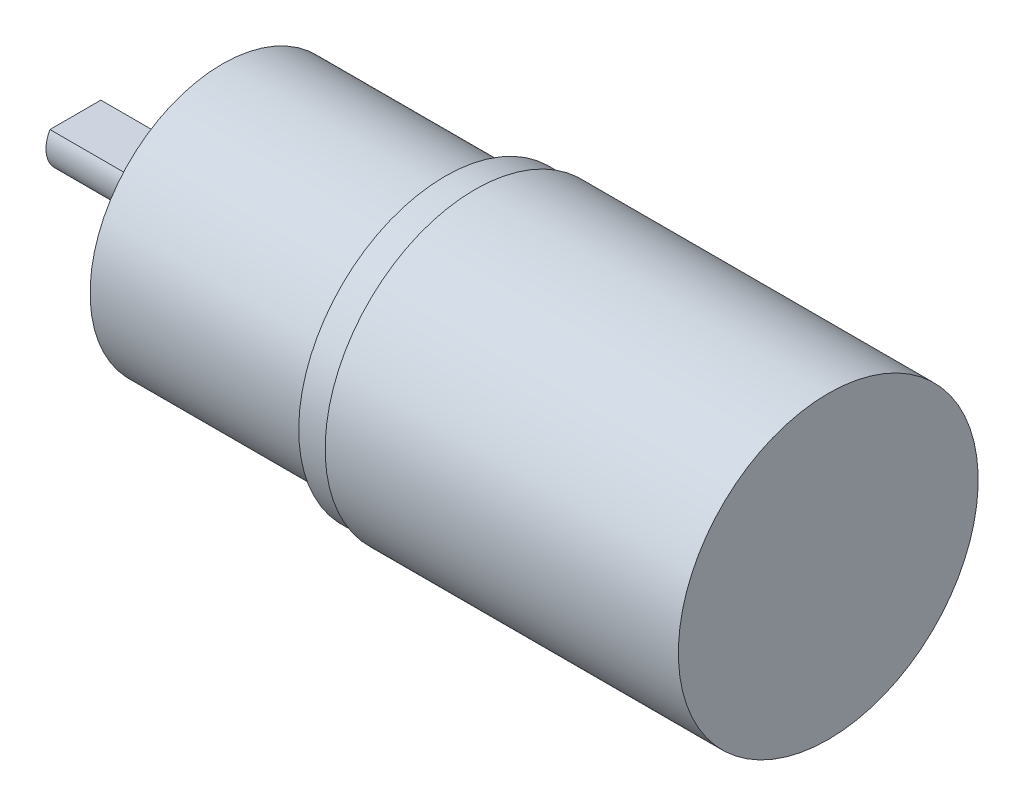
ISO-10303-21;
HEADER;
FILE_DESCRIPTION(('STEP AP214'),'2;1');
FILE_NAME('part.step','',(''),(''),'','','');
FILE_SCHEMA(('AUTOMOTIVE_DESIGN { 1 0 10303 214 1 1 1 1 }'));
ENDSEC;
DATA;
#1=APPLICATION_CONTEXT('core data for automotive mechanical design processes');
#2=APPLICATION_PROTOCOL_DEFINITION('international standard','automotive_design',2000,#1);
#3=PRODUCT_CONTEXT('',#1,'mechanical');
#4=PRODUCT('Part','Part','',(#3));
#5=PRODUCT_RELATED_PRODUCT_CATEGORY('part','',(#4));
#6=PRODUCT_DEFINITION_FORMATION('','',#4);
#7=PRODUCT_DEFINITION_CONTEXT('part definition',#1,'design');
#8=PRODUCT_DEFINITION('design','',#6,#7);
#9=PRODUCT_DEFINITION_SHAPE('','',#8);
#10=(LENGTH_UNIT() NAMED_UNIT(*) SI_UNIT(.MILLI.,.METRE.));
#11=(NAMED_UNIT(*) PLANE_ANGLE_UNIT() SI_UNIT($,.RADIAN.));
#12=(NAMED_UNIT(*) SI_UNIT($,.STERADIAN.) SOLID_ANGLE_UNIT());
#13=UNCERTAINTY_MEASURE_WITH_UNIT(LENGTH_MEASURE(1.E-05),#10,'distance_accuracy_value','');
#14=(GEOMETRIC_REPRESENTATION_CONTEXT(3) GLOBAL_UNCERTAINTY_ASSIGNED_CONTEXT((#13)) GLOBAL_UNIT_ASSIGNED_CONTEXT((#10,
#11,#12)) REPRESENTATION_CONTEXT('',''));
#15=CARTESIAN_POINT('',(0.,0.,0.));
#16=DIRECTION('',(0.,0.,1.));
#17=DIRECTION('',(1.,0.,0.));
#18=AXIS2_PLACEMENT_3D('',#15,#16,#17);
#19=CARTESIAN_POINT('',(15.2822204493793,23.8309239852396,0.));
#20=DIRECTION('',(1.,0.,0.));
#21=DIRECTION('',(0.,1.,0.));
#22=AXIS2_PLACEMENT_3D('',#19,#20,#21);
#23=PLANE('',#22);
#24=CARTESIAN_POINT('',(15.2822204493793,3.43482527761444,0.));
#25=DIRECTION('',(1.,0.,0.));
#26=DIRECTION('',(0.,1.,0.));
#27=AXIS2_PLACEMENT_3D('',#24,#25,#26);
#28=CIRCLE('',#27,20.3960987076252);
#29=CARTESIAN_POINT('',(15.2822204493793,23.8309239852396,0.));
#30=VERTEX_POINT('',#29);
#31=EDGE_CURVE('E105',#30,#30,#28,.T.);
#32=ORIENTED_EDGE('',*,*,#31,.T.);
#33=EDGE_LOOP('',(#32));
#34=FACE_BOUND('',#33,.T.);
#35=ADVANCED_FACE('F33',(#34),#23,.T.);
#36=CARTESIAN_POINT('',(-87.1529344386655,7.43482527761442,0.));
#37=DIRECTION('',(-1.,0.,0.));
#38=DIRECTION('',(0.,-1.,0.));
#39=AXIS2_PLACEMENT_3D('',#36,#37,#38);
#40=PLANE('',#39);
#41=DIRECTION('',(0.,0.,1.));
#42=VECTOR('',#41,1.);
#43=CARTESIAN_POINT('',(-87.1529344386655,5.43482527761442,-6.91077848861216));
#44=LINE('',#43,#42);
#45=CARTESIAN_POINT('',(-87.1529344386655,5.43482527761442,-3.46410161513775));
#46=VERTEX_POINT('',#45);
#47=CARTESIAN_POINT('',(-87.1529344386655,5.43482527761442,3.46410161513775));
#48=VERTEX_POINT('',#47);
#49=EDGE_CURVE('E70',#46,#48,#44,.T.);
#50=ORIENTED_EDGE('',*,*,#49,.F.);
#51=CARTESIAN_POINT('',(-87.1529344386655,3.43482527761442,0.));
#52=DIRECTION('',(1.,0.,0.));
#53=DIRECTION('',(0.,1.,0.));
#54=AXIS2_PLACEMENT_3D('',#51,#52,#53);
#55=CIRCLE('',#54,4.);
#56=EDGE_CURVE('E78',#48,#46,#55,.T.);
#57=ORIENTED_EDGE('',*,*,#56,.F.);
#58=EDGE_LOOP('',(#50,#57));
#59=FACE_BOUND('',#58,.T.);
#60=ADVANCED_FACE('F77',(#59),#40,.T.);
#61=CARTESIAN_POINT('',(15.2822204493793,3.43482527761444,0.));
#62=DIRECTION('',(1.,0.,0.));
#63=DIRECTION('',(0.,1.,0.));
#64=AXIS2_PLACEMENT_3D('',#61,#62,#63);
#65=CYLINDRICAL_SURFACE('',#64,4.);
#66=DIRECTION('',(1.,0.,0.));
#67=VECTOR('',#66,1.);
#68=CARTESIAN_POINT('',(15.2822204493793,5.43482527761444,-3.46410161513775));
#69=LINE('',#68,#67);
#70=CARTESIAN_POINT('',(-72.1529344386655,5.43482527761442,-3.46410161513775));
#71=VERTEX_POINT('',#70);
#72=EDGE_CURVE('E11',#71,#46,#69,.F.);
#73=ORIENTED_EDGE('',*,*,#72,.F.);
#74=CARTESIAN_POINT('',(-72.1529344386655,3.43482527761443,0.));
#75=DIRECTION('',(1.,0.,0.));
#76=DIRECTION('',(0.,0.,-1.));
#77=AXIS2_PLACEMENT_3D('',#74,#75,#76);
#78=CIRCLE('',#77,4.);
#79=CARTESIAN_POINT('',(-72.1529344386655,5.43482527761442,3.46410161513775));
#80=VERTEX_POINT('',#79);
#81=EDGE_CURVE('E82',#80,#71,#78,.F.);
#82=ORIENTED_EDGE('',*,*,#81,.F.);
#83=DIRECTION('',(1.,0.,0.));
#84=VECTOR('',#83,1.);
#85=CARTESIAN_POINT('',(15.2822204493793,5.43482527761444,3.46410161513775));
#86=LINE('',#85,#84);
#87=EDGE_CURVE('E40',#48,#80,#86,.T.);
#88=ORIENTED_EDGE('',*,*,#87,.F.);
#89=ORIENTED_EDGE('',*,*,#56,.T.);
#90=EDGE_LOOP('',(#73,#82,#88,#89));
#91=FACE_BOUND('',#90,.T.);
#92=CARTESIAN_POINT('',(-69.6840575003762,3.43482527761443,0.));
#93=DIRECTION('',(1.,0.,0.));
#94=DIRECTION('',(0.,1.,0.));
#95=AXIS2_PLACEMENT_3D('',#92,#93,#94);
#96=CIRCLE('',#95,4.);
#97=CARTESIAN_POINT('',(-69.6840575003762,7.43482527761442,0.));
#98=VERTEX_POINT('',#97);
#99=EDGE_CURVE('E83',#98,#98,#96,.T.);
#100=ORIENTED_EDGE('',*,*,#99,.F.);
#101=EDGE_LOOP('',(#100));
#102=FACE_BOUND('',#101,.T.);
#103=ADVANCED_FACE('F80',(#91,#102),#65,.T.);
#104=CARTESIAN_POINT('',(-69.6840575003762,9.2736544290133,0.));
#105=DIRECTION('',(-1.,0.,0.));
#106=DIRECTION('',(0.,-1.,0.));
#107=AXIS2_PLACEMENT_3D('',#104,#105,#106);
#108=PLANE('',#107);
#109=ORIENTED_EDGE('',*,*,#99,.T.);
#110=EDGE_LOOP('',(#109));
#111=FACE_BOUND('',#110,.T.);
#112=CARTESIAN_POINT('',(-69.6840575003762,3.43482527761443,0.));
#113=DIRECTION('',(1.,0.,0.));
#114=DIRECTION('',(0.,1.,0.));
#115=AXIS2_PLACEMENT_3D('',#112,#113,#114);
#116=CIRCLE('',#115,5.83882915139887);
#117=CARTESIAN_POINT('',(-69.6840575003762,9.2736544290133,0.));
#118=VERTEX_POINT('',#117);
#119=EDGE_CURVE('E87',#118,#118,#116,.T.);
#120=ORIENTED_EDGE('',*,*,#119,.F.);
#121=EDGE_LOOP('',(#120));
#122=FACE_BOUND('',#121,.T.);
#123=ADVANCED_FACE('F143',(#111,#122),#108,.T.);
#124=CARTESIAN_POINT('',(15.2822204493793,3.43482527761444,0.));
#125=DIRECTION('',(1.,0.,0.));
#126=DIRECTION('',(0.,1.,0.));
#127=AXIS2_PLACEMENT_3D('',#124,#125,#126);
#128=CYLINDRICAL_SURFACE('',#127,5.83882915139887);
#129=ORIENTED_EDGE('',*,*,#119,.T.);
#130=EDGE_LOOP('',(#129));
#131=FACE_BOUND('',#130,.T.);
#132=CARTESIAN_POINT('',(-68.9178786872933,3.43482527761443,0.));
#133=DIRECTION('',(1.,0.,0.));
#134=DIRECTION('',(0.,1.,0.));
#135=AXIS2_PLACEMENT_3D('',#132,#133,#134);
#136=CIRCLE('',#135,5.83882915139887);
#137=CARTESIAN_POINT('',(-68.9178786872933,9.2736544290133,0.));
#138=VERTEX_POINT('',#137);
#139=EDGE_CURVE('E135',#138,#138,#136,.T.);
#140=ORIENTED_EDGE('',*,*,#139,.F.);
#141=EDGE_LOOP('',(#140));
#142=FACE_BOUND('',#141,.T.);
#143=ADVANCED_FACE('F140',(#131,#142),#128,.T.);
#144=CARTESIAN_POINT('',(-68.9178786872933,14.4348252776144,0.));
#145=DIRECTION('',(-1.,0.,0.));
#146=DIRECTION('',(0.,-1.,0.));
#147=AXIS2_PLACEMENT_3D('',#144,#145,#146);
#148=PLANE('',#147);
#149=ORIENTED_EDGE('',*,*,#139,.T.);
#150=EDGE_LOOP('',(#149));
#151=FACE_BOUND('',#150,.T.);
#152=CARTESIAN_POINT('',(-68.9178786872933,3.43482527761443,0.));
#153=DIRECTION('',(1.,0.,0.));
#154=DIRECTION('',(0.,1.,0.));
#155=AXIS2_PLACEMENT_3D('',#152,#153,#154);
#156=CIRCLE('',#155,11.);
#157=CARTESIAN_POINT('',(-68.9178786872933,14.4348252776144,0.));
#158=VERTEX_POINT('',#157);
#159=EDGE_CURVE('E132',#158,#158,#156,.T.);
#160=ORIENTED_EDGE('',*,*,#159,.F.);
#161=EDGE_LOOP('',(#160));
#162=FACE_BOUND('',#161,.T.);
#163=ADVANCED_FACE('F151',(#151,#162),#148,.T.);
#164=CARTESIAN_POINT('',(15.2822204493793,3.43482527761444,0.));
#165=DIRECTION('',(1.,0.,0.));
#166=DIRECTION('',(0.,1.,0.));
#167=AXIS2_PLACEMENT_3D('',#164,#165,#166);
#168=CYLINDRICAL_SURFACE('',#167,11.);
#169=ORIENTED_EDGE('',*,*,#159,.T.);
#170=EDGE_LOOP('',(#169));
#171=FACE_BOUND('',#170,.T.);
#172=CARTESIAN_POINT('',(-67.1529344386655,3.43482527761443,0.));
#173=DIRECTION('',(1.,0.,0.));
#174=DIRECTION('',(0.,1.,0.));
#175=AXIS2_PLACEMENT_3D('',#172,#173,#174);
#176=CIRCLE('',#175,11.);
#177=CARTESIAN_POINT('',(-67.1529344386655,14.4348252776144,0.));
#178=VERTEX_POINT('',#177);
#179=EDGE_CURVE('E129',#178,#178,#176,.T.);
#180=ORIENTED_EDGE('',*,*,#179,.F.);
#181=EDGE_LOOP('',(#180));
#182=FACE_BOUND('',#181,.T.);
#183=ADVANCED_FACE('F157',(#171,#182),#168,.T.);
#184=CARTESIAN_POINT('',(-67.1529344386655,21.4348252776144,0.));
#185=DIRECTION('',(-1.,0.,0.));
#186=DIRECTION('',(0.,-1.,0.));
#187=AXIS2_PLACEMENT_3D('',#184,#185,#186);
#188=PLANE('',#187);
#189=CARTESIAN_POINT('',(-67.1529344386655,13.3503239652306,-9.91549868761621));
#190=DIRECTION('',(-1.,0.,0.));
#191=DIRECTION('',(0.,0.,1.));
#192=AXIS2_PLACEMENT_3D('',#189,#190,#191);
#193=CIRCLE('',#192,1.49999999999999);
#194=CARTESIAN_POINT('',(-67.1529344386655,13.3503239652306,-8.41549868761622));
#195=VERTEX_POINT('',#194);
#196=EDGE_CURVE('E223',#195,#195,#193,.T.);
#197=ORIENTED_EDGE('',*,*,#196,.F.);
#198=EDGE_LOOP('',(#197));
#199=FACE_BOUND('',#198,.T.);
#200=CARTESIAN_POINT('',(-67.1529344386655,13.3503239652306,9.91549868761617));
#201=DIRECTION('',(-1.,0.,0.));
#202=DIRECTION('',(0.,0.,1.));
#203=AXIS2_PLACEMENT_3D('',#200,#201,#202);
#204=CIRCLE('',#203,1.49999999999999);
#205=CARTESIAN_POINT('',(-67.1529344386655,13.3503239652306,11.4154986876162));
#206=VERTEX_POINT('',#205);
#207=EDGE_CURVE('E225',#206,#206,#204,.T.);
#208=ORIENTED_EDGE('',*,*,#207,.F.);
#209=EDGE_LOOP('',(#208));
#210=FACE_BOUND('',#209,.T.);
#211=CARTESIAN_POINT('',(-67.1529344386655,-6.48067341000174,9.91549868761621));
#212=DIRECTION('',(-1.,0.,0.));
#213=DIRECTION('',(0.,0.,1.));
#214=AXIS2_PLACEMENT_3D('',#211,#212,#213);
#215=CIRCLE('',#214,1.49999999999999);
#216=CARTESIAN_POINT('',(-67.1529344386655,-6.48067341000174,11.4154986876162));
#217=VERTEX_POINT('',#216);
#218=EDGE_CURVE('E234',#217,#217,#215,.T.);
#219=ORIENTED_EDGE('',*,*,#218,.F.);
#220=EDGE_LOOP('',(#219));
#221=FACE_BOUND('',#220,.T.);
#222=CARTESIAN_POINT('',(-67.1529344386655,-6.48067341000178,-9.91549868761617));
#223=DIRECTION('',(-1.,0.,0.));
#224=DIRECTION('',(0.,0.,1.));
#225=AXIS2_PLACEMENT_3D('',#222,#223,#224);
#226=CIRCLE('',#225,1.49999999999999);
#227=CARTESIAN_POINT('',(-67.1529344386655,-6.48067341000178,-8.41549868761618));
#228=VERTEX_POINT('',#227);
#229=EDGE_CURVE('E114',#228,#228,#226,.T.);
#230=ORIENTED_EDGE('',*,*,#229,.F.);
#231=EDGE_LOOP('',(#230));
#232=FACE_BOUND('',#231,.T.);
#233=ORIENTED_EDGE('',*,*,#179,.T.);
#234=EDGE_LOOP('',(#233));
#235=FACE_BOUND('',#234,.T.);
#236=CARTESIAN_POINT('',(-67.1529344386655,3.43482527761443,0.));
#237=DIRECTION('',(1.,0.,0.));
#238=DIRECTION('',(0.,1.,0.));
#239=AXIS2_PLACEMENT_3D('',#236,#237,#238);
#240=CIRCLE('',#239,18.);
#241=CARTESIAN_POINT('',(-67.1529344386655,21.4348252776144,0.));
#242=VERTEX_POINT('',#241);
#243=EDGE_CURVE('E126',#242,#242,#240,.T.);
#244=ORIENTED_EDGE('',*,*,#243,.F.);
#245=EDGE_LOOP('',(#244));
#246=FACE_BOUND('',#245,.T.);
#247=ADVANCED_FACE('F161',(#199,#210,#221,#232,#235,#246),#188,.T.);
#248=CARTESIAN_POINT('',(15.2822204493793,3.43482527761444,0.));
#249=DIRECTION('',(1.,0.,0.));
#250=DIRECTION('',(0.,1.,0.));
#251=AXIS2_PLACEMENT_3D('',#248,#249,#250);
#252=CYLINDRICAL_SURFACE('',#251,18.);
#253=ORIENTED_EDGE('',*,*,#243,.T.);
#254=EDGE_LOOP('',(#253));
#255=FACE_BOUND('',#254,.T.);
#256=CARTESIAN_POINT('',(-36.8532953597755,3.43482527761443,0.));
#257=DIRECTION('',(1.,0.,0.));
#258=DIRECTION('',(0.,1.,0.));
#259=AXIS2_PLACEMENT_3D('',#256,#257,#258);
#260=CIRCLE('',#259,18.);
#261=CARTESIAN_POINT('',(-36.8532953597755,21.4348252776144,0.));
#262=VERTEX_POINT('',#261);
#263=EDGE_CURVE('E123',#262,#262,#260,.T.);
#264=ORIENTED_EDGE('',*,*,#263,.F.);
#265=EDGE_LOOP('',(#264));
#266=FACE_BOUND('',#265,.T.);
#267=ADVANCED_FACE('F165',(#255,#266),#252,.T.);
#268=CARTESIAN_POINT('',(-36.8532953597755,23.3502723103216,0.));
#269=DIRECTION('',(-1.,0.,0.));
#270=DIRECTION('',(0.,-1.,0.));
#271=AXIS2_PLACEMENT_3D('',#268,#269,#270);
#272=PLANE('',#271);
#273=ORIENTED_EDGE('',*,*,#263,.T.);
#274=EDGE_LOOP('',(#273));
#275=FACE_BOUND('',#274,.T.);
#276=CARTESIAN_POINT('',(-36.8532953597755,3.43482527761443,0.));
#277=DIRECTION('',(1.,0.,0.));
#278=DIRECTION('',(0.,1.,0.));
#279=AXIS2_PLACEMENT_3D('',#276,#277,#278);
#280=CIRCLE('',#279,19.9154470327072);
#281=CARTESIAN_POINT('',(-36.8532953597755,23.3502723103216,0.));
#282=VERTEX_POINT('',#281);
#283=EDGE_CURVE('E120',#282,#282,#280,.T.);
#284=ORIENTED_EDGE('',*,*,#283,.F.);
#285=EDGE_LOOP('',(#284));
#286=FACE_BOUND('',#285,.T.);
#287=ADVANCED_FACE('F169',(#275,#286),#272,.T.);
#288=CARTESIAN_POINT('',(15.2822204493793,3.43482527761444,0.));
#289=DIRECTION('',(1.,0.,0.));
#290=DIRECTION('',(0.,1.,0.));
#291=AXIS2_PLACEMENT_3D('',#288,#289,#290);
#292=CYLINDRICAL_SURFACE('',#291,19.9154470327072);
#293=ORIENTED_EDGE('',*,*,#283,.T.);
#294=EDGE_LOOP('',(#293));
#295=FACE_BOUND('',#294,.T.);
#296=CARTESIAN_POINT('',(-32.7752546336772,3.43482527761443,0.));
#297=DIRECTION('',(1.,0.,0.));
#298=DIRECTION('',(0.,1.,0.));
#299=AXIS2_PLACEMENT_3D('',#296,#297,#298);
#300=CIRCLE('',#299,19.9154470327072);
#301=CARTESIAN_POINT('',(-32.7752546336772,23.3502723103216,0.));
#302=VERTEX_POINT('',#301);
#303=EDGE_CURVE('E111',#302,#302,#300,.T.);
#304=ORIENTED_EDGE('',*,*,#303,.F.);
#305=EDGE_LOOP('',(#304));
#306=FACE_BOUND('',#305,.T.);
#307=ADVANCED_FACE('F173',(#295,#306),#292,.T.);
#308=CARTESIAN_POINT('',(-32.7752546336772,23.8309239852396,0.));
#309=DIRECTION('',(-1.,0.,0.));
#310=DIRECTION('',(0.,-1.,0.));
#311=AXIS2_PLACEMENT_3D('',#308,#309,#310);
#312=PLANE('',#311);
#313=ORIENTED_EDGE('',*,*,#303,.T.);
#314=EDGE_LOOP('',(#313));
#315=FACE_BOUND('',#314,.T.);
#316=CARTESIAN_POINT('',(-32.7752546336772,3.43482527761443,0.));
#317=DIRECTION('',(1.,0.,0.));
#318=DIRECTION('',(0.,1.,0.));
#319=AXIS2_PLACEMENT_3D('',#316,#317,#318);
#320=CIRCLE('',#319,20.3960987076252);
#321=CARTESIAN_POINT('',(-32.7752546336772,23.8309239852396,0.));
#322=VERTEX_POINT('',#321);
#323=EDGE_CURVE('E107',#322,#322,#320,.T.);
#324=ORIENTED_EDGE('',*,*,#323,.F.);
#325=EDGE_LOOP('',(#324));
#326=FACE_BOUND('',#325,.T.);
#327=ADVANCED_FACE('F177',(#315,#326),#312,.T.);
#328=CARTESIAN_POINT('',(15.2822204493793,3.43482527761444,0.));
#329=DIRECTION('',(1.,0.,0.));
#330=DIRECTION('',(0.,1.,0.));
#331=AXIS2_PLACEMENT_3D('',#328,#329,#330);
#332=CYLINDRICAL_SURFACE('',#331,20.3960987076252);
#333=ORIENTED_EDGE('',*,*,#323,.T.);
#334=EDGE_LOOP('',(#333));
#335=FACE_BOUND('',#334,.T.);
#336=ORIENTED_EDGE('',*,*,#31,.F.);
#337=EDGE_LOOP('',(#336));
#338=FACE_BOUND('',#337,.T.);
#339=ADVANCED_FACE('F181',(#335,#338),#332,.T.);
#340=CARTESIAN_POINT('',(-59.1529344386655,-6.48067341000178,-9.91549868761617));
#341=DIRECTION('',(-1.,0.,0.));
#342=DIRECTION('',(0.,0.,1.));
#343=AXIS2_PLACEMENT_3D('',#340,#341,#342);
#344=CONICAL_SURFACE('',#343,1.5,1.02974425867665);
#345=CARTESIAN_POINT('',(-58.2516435101241,-6.48067341000178,-9.91549868761617));
#346=VERTEX_POINT('',#345);
#347=VERTEX_LOOP('',#346);
#348=FACE_BOUND('',#347,.T.);
#349=CARTESIAN_POINT('',(-59.1529344386655,-6.48067341000178,-9.91549868761617));
#350=DIRECTION('',(-1.,0.,0.));
#351=DIRECTION('',(0.,0.,1.));
#352=AXIS2_PLACEMENT_3D('',#349,#350,#351);
#353=CIRCLE('',#352,1.5);
#354=CARTESIAN_POINT('',(-59.1529344386655,-6.48067341000178,-8.41549868761617));
#355=VERTEX_POINT('',#354);
#356=EDGE_CURVE('E108',#355,#355,#353,.T.);
#357=ORIENTED_EDGE('',*,*,#356,.T.);
#358=EDGE_LOOP('',(#357));
#359=FACE_BOUND('',#358,.T.);
#360=ADVANCED_FACE('F185',(#348,#359),#344,.F.);
#361=CARTESIAN_POINT('',(-67.1529344386655,-6.48067341000178,-9.91549868761617));
#362=DIRECTION('',(-1.,0.,0.));
#363=DIRECTION('',(0.,0.,1.));
#364=AXIS2_PLACEMENT_3D('',#361,#362,#363);
#365=CYLINDRICAL_SURFACE('',#364,1.49999999999999);
#366=ORIENTED_EDGE('',*,*,#356,.F.);
#367=EDGE_LOOP('',(#366));
#368=FACE_BOUND('',#367,.T.);
#369=ORIENTED_EDGE('',*,*,#229,.T.);
#370=EDGE_LOOP('',(#369));
#371=FACE_BOUND('',#370,.T.);
#372=ADVANCED_FACE('F189',(#368,#371),#365,.F.);
#373=CARTESIAN_POINT('',(-59.1529344386655,-6.48067341000174,9.91549868761621));
#374=DIRECTION('',(-1.,0.,0.));
#375=DIRECTION('',(0.,0.,1.));
#376=AXIS2_PLACEMENT_3D('',#373,#374,#375);
#377=CONICAL_SURFACE('',#376,1.5,1.02974425867665);
#378=CARTESIAN_POINT('',(-58.2516435101241,-6.48067341000175,9.91549868761621));
#379=VERTEX_POINT('',#378);
#380=VERTEX_LOOP('',#379);
#381=FACE_BOUND('',#380,.T.);
#382=CARTESIAN_POINT('',(-59.1529344386655,-6.48067341000174,9.91549868761621));
#383=DIRECTION('',(-1.,0.,0.));
#384=DIRECTION('',(0.,0.,1.));
#385=AXIS2_PLACEMENT_3D('',#382,#383,#384);
#386=CIRCLE('',#385,1.5);
#387=CARTESIAN_POINT('',(-59.1529344386655,-6.48067341000174,11.4154986876162));
#388=VERTEX_POINT('',#387);
#389=EDGE_CURVE('E237',#388,#388,#386,.T.);
#390=ORIENTED_EDGE('',*,*,#389,.T.);
#391=EDGE_LOOP('',(#390));
#392=FACE_BOUND('',#391,.T.);
#393=ADVANCED_FACE('F192',(#381,#392),#377,.F.);
#394=CARTESIAN_POINT('',(-67.1529344386655,-6.48067341000174,9.91549868761621));
#395=DIRECTION('',(-1.,0.,0.));
#396=DIRECTION('',(0.,0.,1.));
#397=AXIS2_PLACEMENT_3D('',#394,#395,#396);
#398=CYLINDRICAL_SURFACE('',#397,1.49999999999999);
#399=ORIENTED_EDGE('',*,*,#389,.F.);
#400=EDGE_LOOP('',(#399));
#401=FACE_BOUND('',#400,.T.);
#402=ORIENTED_EDGE('',*,*,#218,.T.);
#403=EDGE_LOOP('',(#402));
#404=FACE_BOUND('',#403,.T.);
#405=ADVANCED_FACE('F196',(#401,#404),#398,.F.);
#406=CARTESIAN_POINT('',(-59.1529344386655,13.3503239652306,9.91549868761617));
#407=DIRECTION('',(-1.,0.,0.));
#408=DIRECTION('',(0.,0.,1.));
#409=AXIS2_PLACEMENT_3D('',#406,#407,#408);
#410=CONICAL_SURFACE('',#409,1.5,1.02974425867665);
#411=CARTESIAN_POINT('',(-58.2516435101241,13.3503239652306,9.91549868761617));
#412=VERTEX_POINT('',#411);
#413=VERTEX_LOOP('',#412);
#414=FACE_BOUND('',#413,.T.);
#415=CARTESIAN_POINT('',(-59.1529344386655,13.3503239652306,9.91549868761617));
#416=DIRECTION('',(-1.,0.,0.));
#417=DIRECTION('',(0.,0.,1.));
#418=AXIS2_PLACEMENT_3D('',#415,#416,#417);
#419=CIRCLE('',#418,1.5);
#420=CARTESIAN_POINT('',(-59.1529344386655,13.3503239652306,11.4154986876162));
#421=VERTEX_POINT('',#420);
#422=EDGE_CURVE('E231',#421,#421,#419,.T.);
#423=ORIENTED_EDGE('',*,*,#422,.T.);
#424=EDGE_LOOP('',(#423));
#425=FACE_BOUND('',#424,.T.);
#426=ADVANCED_FACE('F200',(#414,#425),#410,.F.);
#427=CARTESIAN_POINT('',(-67.1529344386655,13.3503239652306,9.91549868761617));
#428=DIRECTION('',(-1.,0.,0.));
#429=DIRECTION('',(0.,0.,1.));
#430=AXIS2_PLACEMENT_3D('',#427,#428,#429);
#431=CYLINDRICAL_SURFACE('',#430,1.49999999999999);
#432=ORIENTED_EDGE('',*,*,#422,.F.);
#433=EDGE_LOOP('',(#432));
#434=FACE_BOUND('',#433,.T.);
#435=ORIENTED_EDGE('',*,*,#207,.T.);
#436=EDGE_LOOP('',(#435));
#437=FACE_BOUND('',#436,.T.);
#438=ADVANCED_FACE('F204',(#434,#437),#431,.F.);
#439=CARTESIAN_POINT('',(-59.1529344386655,13.3503239652306,-9.91549868761621));
#440=DIRECTION('',(-1.,0.,0.));
#441=DIRECTION('',(0.,0.,1.));
#442=AXIS2_PLACEMENT_3D('',#439,#440,#441);
#443=CONICAL_SURFACE('',#442,1.5,1.02974425867665);
#444=CARTESIAN_POINT('',(-58.2516435101241,13.3503239652306,-9.91549868761621));
#445=VERTEX_POINT('',#444);
#446=VERTEX_LOOP('',#445);
#447=FACE_BOUND('',#446,.T.);
#448=CARTESIAN_POINT('',(-59.1529344386655,13.3503239652306,-9.91549868761621));
#449=DIRECTION('',(-1.,0.,0.));
#450=DIRECTION('',(0.,0.,1.));
#451=AXIS2_PLACEMENT_3D('',#448,#449,#450);
#452=CIRCLE('',#451,1.5);
#453=CARTESIAN_POINT('',(-59.1529344386655,13.3503239652306,-8.41549868761621));
#454=VERTEX_POINT('',#453);
#455=EDGE_CURVE('E220',#454,#454,#452,.T.);
#456=ORIENTED_EDGE('',*,*,#455,.T.);
#457=EDGE_LOOP('',(#456));
#458=FACE_BOUND('',#457,.T.);
#459=ADVANCED_FACE('F208',(#447,#458),#443,.F.);
#460=CARTESIAN_POINT('',(-67.1529344386655,13.3503239652306,-9.91549868761621));
#461=DIRECTION('',(-1.,0.,0.));
#462=DIRECTION('',(0.,0.,1.));
#463=AXIS2_PLACEMENT_3D('',#460,#461,#462);
#464=CYLINDRICAL_SURFACE('',#463,1.49999999999999);
#465=ORIENTED_EDGE('',*,*,#455,.F.);
#466=EDGE_LOOP('',(#465));
#467=FACE_BOUND('',#466,.T.);
#468=ORIENTED_EDGE('',*,*,#196,.T.);
#469=EDGE_LOOP('',(#468));
#470=FACE_BOUND('',#469,.T.);
#471=ADVANCED_FACE('F96',(#467,#470),#464,.F.);
#472=CARTESIAN_POINT('',(-72.1529344386655,5.43482527761443,-6.91077848861216));
#473=DIRECTION('',(0.,-1.,0.));
#474=DIRECTION('',(1.,0.,0.));
#475=AXIS2_PLACEMENT_3D('',#472,#473,#474);
#476=PLANE('',#475);
#477=ORIENTED_EDGE('',*,*,#72,.T.);
#478=ORIENTED_EDGE('',*,*,#49,.T.);
#479=ORIENTED_EDGE('',*,*,#87,.T.);
#480=DIRECTION('',(0.,0.,1.));
#481=VECTOR('',#480,1.);
#482=CARTESIAN_POINT('',(-72.1529344386655,5.43482527761443,-6.91077848861216));
#483=LINE('',#482,#481);
#484=EDGE_CURVE('E46',#71,#80,#483,.T.);
#485=ORIENTED_EDGE('',*,*,#484,.F.);
#486=EDGE_LOOP('',(#477,#478,#479,#485));
#487=FACE_BOUND('',#486,.T.);
#488=ADVANCED_FACE('F69',(#487),#476,.F.);
#489=CARTESIAN_POINT('',(-72.1529344386655,0.,0.));
#490=DIRECTION('',(1.,0.,0.));
#491=DIRECTION('',(0.,0.,-1.));
#492=AXIS2_PLACEMENT_3D('',#489,#490,#491);
#493=PLANE('',#492);
#494=ORIENTED_EDGE('',*,*,#81,.T.);
#495=ORIENTED_EDGE('',*,*,#484,.T.);
#496=EDGE_LOOP('',(#494,#495));
#497=FACE_BOUND('',#496,.T.);
#498=ADVANCED_FACE('F90',(#497),#493,.F.);
#499=CLOSED_SHELL('',(#35,#60,#103,#123,#143,#163,#183,#247,#267,#287,#307,#327,#339,#360,#372,
#393,#405,#426,#438,#459,#471,#488,#498));
#500=MANIFOLD_SOLID_BREP('B2',#499);
#501=ADVANCED_BREP_SHAPE_REPRESENTATION('',(#18,#500),#14);
#502=SHAPE_DEFINITION_REPRESENTATION(#9,#501);
ENDSEC;
END-ISO-10303-21;
